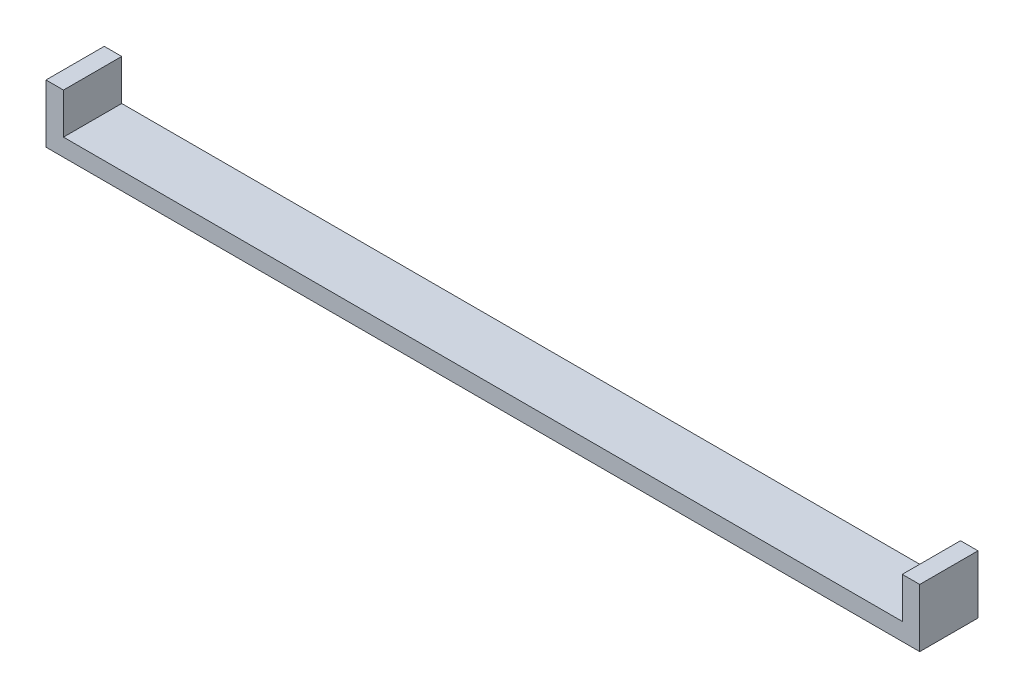
ISO-10303-21;
HEADER;
FILE_DESCRIPTION(('STEP AP214'),'2;1');
FILE_NAME('part.step','',(''),(''),'','','');
FILE_SCHEMA(('AUTOMOTIVE_DESIGN { 1 0 10303 214 1 1 1 1 }'));
ENDSEC;
DATA;
#1=APPLICATION_CONTEXT('core data for automotive mechanical design processes');
#2=APPLICATION_PROTOCOL_DEFINITION('international standard','automotive_design',2000,#1);
#3=PRODUCT_CONTEXT('',#1,'mechanical');
#4=PRODUCT('Part','Part','',(#3));
#5=PRODUCT_RELATED_PRODUCT_CATEGORY('part','',(#4));
#6=PRODUCT_DEFINITION_FORMATION('','',#4);
#7=PRODUCT_DEFINITION_CONTEXT('part definition',#1,'design');
#8=PRODUCT_DEFINITION('design','',#6,#7);
#9=PRODUCT_DEFINITION_SHAPE('','',#8);
#10=(LENGTH_UNIT() NAMED_UNIT(*) SI_UNIT(.MILLI.,.METRE.));
#11=(NAMED_UNIT(*) PLANE_ANGLE_UNIT() SI_UNIT($,.RADIAN.));
#12=(NAMED_UNIT(*) SI_UNIT($,.STERADIAN.) SOLID_ANGLE_UNIT());
#13=UNCERTAINTY_MEASURE_WITH_UNIT(LENGTH_MEASURE(1.E-05),#10,'distance_accuracy_value','');
#14=(GEOMETRIC_REPRESENTATION_CONTEXT(3) GLOBAL_UNCERTAINTY_ASSIGNED_CONTEXT((#13)) GLOBAL_UNIT_ASSIGNED_CONTEXT((#10,
#11,#12)) REPRESENTATION_CONTEXT('',''));
#15=CARTESIAN_POINT('',(0.,0.,0.));
#16=DIRECTION('',(0.,0.,1.));
#17=DIRECTION('',(1.,0.,0.));
#18=AXIS2_PLACEMENT_3D('',#15,#16,#17);
#19=CARTESIAN_POINT('',(-74.3534482758621,-27.9310344827577,10.));
#20=DIRECTION('',(1.,0.,0.));
#21=DIRECTION('',(0.,0.,-1.));
#22=AXIS2_PLACEMENT_3D('',#19,#20,#21);
#23=PLANE('',#22);
#24=DIRECTION('',(0.,-1.,0.));
#25=VECTOR('',#24,1.);
#26=CARTESIAN_POINT('',(-74.3534482758621,-27.9310344827577,0.));
#27=LINE('',#26,#25);
#28=CARTESIAN_POINT('',(-74.3534482758621,-27.9310344827577,0.));
#29=VERTEX_POINT('',#28);
#30=CARTESIAN_POINT('',(-74.3534482758621,-37.9310344827577,0.));
#31=VERTEX_POINT('',#30);
#32=EDGE_CURVE('E140',#29,#31,#27,.T.);
#33=ORIENTED_EDGE('',*,*,#32,.T.);
#34=DIRECTION('',(0.,0.,-1.));
#35=VECTOR('',#34,1.);
#36=CARTESIAN_POINT('',(-74.3534482758621,-37.9310344827577,10.));
#37=LINE('',#36,#35);
#38=CARTESIAN_POINT('',(-74.3534482758621,-37.9310344827577,10.));
#39=VERTEX_POINT('',#38);
#40=EDGE_CURVE('E11',#39,#31,#37,.T.);
#41=ORIENTED_EDGE('',*,*,#40,.F.);
#42=DIRECTION('',(0.,-1.,0.));
#43=VECTOR('',#42,1.);
#44=CARTESIAN_POINT('',(-74.3534482758621,-27.9310344827577,10.));
#45=LINE('',#44,#43);
#46=CARTESIAN_POINT('',(-74.3534482758621,-27.9310344827577,10.));
#47=VERTEX_POINT('',#46);
#48=EDGE_CURVE('E162',#47,#39,#45,.T.);
#49=ORIENTED_EDGE('',*,*,#48,.F.);
#50=DIRECTION('',(0.,0.,-1.));
#51=VECTOR('',#50,1.);
#52=CARTESIAN_POINT('',(-74.3534482758621,-27.9310344827577,10.));
#53=LINE('',#52,#51);
#54=EDGE_CURVE('E136',#47,#29,#53,.T.);
#55=ORIENTED_EDGE('',*,*,#54,.T.);
#56=EDGE_LOOP('',(#33,#41,#49,#55));
#57=FACE_BOUND('',#56,.T.);
#58=ADVANCED_FACE('F39',(#57),#23,.F.);
#59=CARTESIAN_POINT('',(-74.3534482758621,-37.9310344827577,10.));
#60=DIRECTION('',(0.,1.,0.));
#61=DIRECTION('',(-1.,0.,0.));
#62=AXIS2_PLACEMENT_3D('',#59,#60,#61);
#63=PLANE('',#62);
#64=DIRECTION('',(1.,0.,0.));
#65=VECTOR('',#64,1.);
#66=CARTESIAN_POINT('',(-74.3534482758621,-37.9310344827577,0.));
#67=LINE('',#66,#65);
#68=CARTESIAN_POINT('',(75.6465517241379,-37.9310344827586,0.));
#69=VERTEX_POINT('',#68);
#70=EDGE_CURVE('E144',#31,#69,#67,.T.);
#71=ORIENTED_EDGE('',*,*,#70,.T.);
#72=DIRECTION('',(0.,0.,-1.));
#73=VECTOR('',#72,1.);
#74=CARTESIAN_POINT('',(75.6465517241379,-37.9310344827586,10.));
#75=LINE('',#74,#73);
#76=CARTESIAN_POINT('',(75.6465517241379,-37.9310344827586,10.));
#77=VERTEX_POINT('',#76);
#78=EDGE_CURVE('E48',#77,#69,#75,.T.);
#79=ORIENTED_EDGE('',*,*,#78,.F.);
#80=DIRECTION('',(1.,0.,0.));
#81=VECTOR('',#80,1.);
#82=CARTESIAN_POINT('',(-74.3534482758621,-37.9310344827577,10.));
#83=LINE('',#82,#81);
#84=EDGE_CURVE('E99',#39,#77,#83,.T.);
#85=ORIENTED_EDGE('',*,*,#84,.F.);
#86=ORIENTED_EDGE('',*,*,#40,.T.);
#87=EDGE_LOOP('',(#71,#79,#85,#86));
#88=FACE_BOUND('',#87,.T.);
#89=ADVANCED_FACE('F208',(#88),#63,.F.);
#90=CARTESIAN_POINT('',(75.6465517241379,-37.9310344827586,10.));
#91=DIRECTION('',(-1.,0.,0.));
#92=DIRECTION('',(0.,0.,1.));
#93=AXIS2_PLACEMENT_3D('',#90,#91,#92);
#94=PLANE('',#93);
#95=DIRECTION('',(0.,1.,0.));
#96=VECTOR('',#95,1.);
#97=CARTESIAN_POINT('',(75.6465517241379,-37.9310344827586,0.));
#98=LINE('',#97,#96);
#99=CARTESIAN_POINT('',(75.6465517241379,-27.9310344827586,0.));
#100=VERTEX_POINT('',#99);
#101=EDGE_CURVE('E147',#69,#100,#98,.T.);
#102=ORIENTED_EDGE('',*,*,#101,.T.);
#103=DIRECTION('',(0.,0.,-1.));
#104=VECTOR('',#103,1.);
#105=CARTESIAN_POINT('',(75.6465517241379,-27.9310344827586,10.));
#106=LINE('',#105,#104);
#107=CARTESIAN_POINT('',(75.6465517241379,-27.9310344827586,10.));
#108=VERTEX_POINT('',#107);
#109=EDGE_CURVE('E173',#108,#100,#106,.T.);
#110=ORIENTED_EDGE('',*,*,#109,.F.);
#111=DIRECTION('',(0.,1.,0.));
#112=VECTOR('',#111,1.);
#113=CARTESIAN_POINT('',(75.6465517241379,-37.9310344827586,10.));
#114=LINE('',#113,#112);
#115=EDGE_CURVE('E183',#77,#108,#114,.T.);
#116=ORIENTED_EDGE('',*,*,#115,.F.);
#117=ORIENTED_EDGE('',*,*,#78,.T.);
#118=EDGE_LOOP('',(#102,#110,#116,#117));
#119=FACE_BOUND('',#118,.T.);
#120=ADVANCED_FACE('F181',(#119),#94,.F.);
#121=CARTESIAN_POINT('',(75.6465517241379,-27.9310344827586,10.));
#122=DIRECTION('',(0.,-1.,0.));
#123=DIRECTION('',(0.,0.,-1.));
#124=AXIS2_PLACEMENT_3D('',#121,#122,#123);
#125=PLANE('',#124);
#126=DIRECTION('',(-1.,0.,0.));
#127=VECTOR('',#126,1.);
#128=CARTESIAN_POINT('',(75.6465517241379,-27.9310344827586,0.));
#129=LINE('',#128,#127);
#130=CARTESIAN_POINT('',(72.6465517241379,-27.9310344827586,0.));
#131=VERTEX_POINT('',#130);
#132=EDGE_CURVE('E150',#100,#131,#129,.T.);
#133=ORIENTED_EDGE('',*,*,#132,.T.);
#134=DIRECTION('',(0.,0.,-1.));
#135=VECTOR('',#134,1.);
#136=CARTESIAN_POINT('',(72.6465517241379,-27.9310344827586,10.));
#137=LINE('',#136,#135);
#138=CARTESIAN_POINT('',(72.6465517241379,-27.9310344827586,10.));
#139=VERTEX_POINT('',#138);
#140=EDGE_CURVE('E169',#139,#131,#137,.T.);
#141=ORIENTED_EDGE('',*,*,#140,.F.);
#142=DIRECTION('',(-1.,0.,0.));
#143=VECTOR('',#142,1.);
#144=CARTESIAN_POINT('',(75.6465517241379,-27.9310344827586,10.));
#145=LINE('',#144,#143);
#146=EDGE_CURVE('E196',#108,#139,#145,.T.);
#147=ORIENTED_EDGE('',*,*,#146,.F.);
#148=ORIENTED_EDGE('',*,*,#109,.T.);
#149=EDGE_LOOP('',(#133,#141,#147,#148));
#150=FACE_BOUND('',#149,.T.);
#151=ADVANCED_FACE('F191',(#150),#125,.F.);
#152=CARTESIAN_POINT('',(72.6465517241379,-27.9310344827586,10.));
#153=DIRECTION('',(1.,0.,0.));
#154=DIRECTION('',(0.,1.,0.));
#155=AXIS2_PLACEMENT_3D('',#152,#153,#154);
#156=PLANE('',#155);
#157=DIRECTION('',(0.,-1.,0.));
#158=VECTOR('',#157,1.);
#159=CARTESIAN_POINT('',(72.6465517241379,-27.9310344827586,0.));
#160=LINE('',#159,#158);
#161=CARTESIAN_POINT('',(72.6465517241379,-34.9310344827586,0.));
#162=VERTEX_POINT('',#161);
#163=EDGE_CURVE('E153',#131,#162,#160,.T.);
#164=ORIENTED_EDGE('',*,*,#163,.T.);
#165=DIRECTION('',(0.,0.,-1.));
#166=VECTOR('',#165,1.);
#167=CARTESIAN_POINT('',(72.6465517241379,-34.9310344827586,10.));
#168=LINE('',#167,#166);
#169=CARTESIAN_POINT('',(72.6465517241379,-34.9310344827586,10.));
#170=VERTEX_POINT('',#169);
#171=EDGE_CURVE('E129',#170,#162,#168,.T.);
#172=ORIENTED_EDGE('',*,*,#171,.F.);
#173=DIRECTION('',(0.,-1.,0.));
#174=VECTOR('',#173,1.);
#175=CARTESIAN_POINT('',(72.6465517241379,-27.9310344827586,10.));
#176=LINE('',#175,#174);
#177=EDGE_CURVE('E118',#139,#170,#176,.T.);
#178=ORIENTED_EDGE('',*,*,#177,.F.);
#179=ORIENTED_EDGE('',*,*,#140,.T.);
#180=EDGE_LOOP('',(#164,#172,#178,#179));
#181=FACE_BOUND('',#180,.T.);
#182=ADVANCED_FACE('F194',(#181),#156,.F.);
#183=CARTESIAN_POINT('',(72.6465517241379,-34.9310344827586,10.));
#184=DIRECTION('',(0.,-1.,0.));
#185=DIRECTION('',(1.,0.,0.));
#186=AXIS2_PLACEMENT_3D('',#183,#184,#185);
#187=PLANE('',#186);
#188=DIRECTION('',(-1.,0.,0.));
#189=VECTOR('',#188,1.);
#190=CARTESIAN_POINT('',(72.6465517241379,-34.9310344827586,0.));
#191=LINE('',#190,#189);
#192=CARTESIAN_POINT('',(-71.3534482758621,-34.9310344827577,0.));
#193=VERTEX_POINT('',#192);
#194=EDGE_CURVE('E127',#162,#193,#191,.T.);
#195=ORIENTED_EDGE('',*,*,#194,.T.);
#196=DIRECTION('',(0.,0.,-1.));
#197=VECTOR('',#196,1.);
#198=CARTESIAN_POINT('',(-71.3534482758621,-34.9310344827577,10.));
#199=LINE('',#198,#197);
#200=CARTESIAN_POINT('',(-71.3534482758621,-34.9310344827577,10.));
#201=VERTEX_POINT('',#200);
#202=EDGE_CURVE('E124',#201,#193,#199,.T.);
#203=ORIENTED_EDGE('',*,*,#202,.F.);
#204=DIRECTION('',(-1.,0.,0.));
#205=VECTOR('',#204,1.);
#206=CARTESIAN_POINT('',(72.6465517241379,-34.9310344827586,10.));
#207=LINE('',#206,#205);
#208=EDGE_CURVE('E112',#170,#201,#207,.T.);
#209=ORIENTED_EDGE('',*,*,#208,.F.);
#210=ORIENTED_EDGE('',*,*,#171,.T.);
#211=EDGE_LOOP('',(#195,#203,#209,#210));
#212=FACE_BOUND('',#211,.T.);
#213=ADVANCED_FACE('F125',(#212),#187,.F.);
#214=CARTESIAN_POINT('',(-71.3534482758621,-34.9310344827577,10.));
#215=DIRECTION('',(-1.,0.,0.));
#216=DIRECTION('',(0.,0.,1.));
#217=AXIS2_PLACEMENT_3D('',#214,#215,#216);
#218=PLANE('',#217);
#219=DIRECTION('',(0.,1.,0.));
#220=VECTOR('',#219,1.);
#221=CARTESIAN_POINT('',(-71.3534482758621,-34.9310344827577,0.));
#222=LINE('',#221,#220);
#223=CARTESIAN_POINT('',(-71.3534482758621,-27.9310344827577,0.));
#224=VERTEX_POINT('',#223);
#225=EDGE_CURVE('E85',#193,#224,#222,.T.);
#226=ORIENTED_EDGE('',*,*,#225,.T.);
#227=DIRECTION('',(0.,0.,-1.));
#228=VECTOR('',#227,1.);
#229=CARTESIAN_POINT('',(-71.3534482758621,-27.9310344827577,10.));
#230=LINE('',#229,#228);
#231=CARTESIAN_POINT('',(-71.3534482758621,-27.9310344827577,10.));
#232=VERTEX_POINT('',#231);
#233=EDGE_CURVE('E130',#232,#224,#230,.T.);
#234=ORIENTED_EDGE('',*,*,#233,.F.);
#235=DIRECTION('',(0.,1.,0.));
#236=VECTOR('',#235,1.);
#237=CARTESIAN_POINT('',(-71.3534482758621,-34.9310344827577,10.));
#238=LINE('',#237,#236);
#239=EDGE_CURVE('E116',#201,#232,#238,.T.);
#240=ORIENTED_EDGE('',*,*,#239,.F.);
#241=ORIENTED_EDGE('',*,*,#202,.T.);
#242=EDGE_LOOP('',(#226,#234,#240,#241));
#243=FACE_BOUND('',#242,.T.);
#244=ADVANCED_FACE('F132',(#243),#218,.F.);
#245=CARTESIAN_POINT('',(-71.3534482758621,-27.9310344827577,10.));
#246=DIRECTION('',(0.,-1.,0.));
#247=DIRECTION('',(1.,0.,0.));
#248=AXIS2_PLACEMENT_3D('',#245,#246,#247);
#249=PLANE('',#248);
#250=DIRECTION('',(-1.,0.,0.));
#251=VECTOR('',#250,1.);
#252=CARTESIAN_POINT('',(-71.3534482758621,-27.9310344827577,0.));
#253=LINE('',#252,#251);
#254=EDGE_CURVE('E91',#224,#29,#253,.T.);
#255=ORIENTED_EDGE('',*,*,#254,.T.);
#256=ORIENTED_EDGE('',*,*,#54,.F.);
#257=DIRECTION('',(-1.,0.,0.));
#258=VECTOR('',#257,1.);
#259=CARTESIAN_POINT('',(-71.3534482758621,-27.9310344827577,10.));
#260=LINE('',#259,#258);
#261=EDGE_CURVE('E56',#232,#47,#260,.T.);
#262=ORIENTED_EDGE('',*,*,#261,.F.);
#263=ORIENTED_EDGE('',*,*,#233,.T.);
#264=EDGE_LOOP('',(#255,#256,#262,#263));
#265=FACE_BOUND('',#264,.T.);
#266=ADVANCED_FACE('F224',(#265),#249,.F.);
#267=CARTESIAN_POINT('',(0.,0.,10.));
#268=DIRECTION('',(0.,0.,1.));
#269=DIRECTION('',(1.,0.,0.));
#270=AXIS2_PLACEMENT_3D('',#267,#268,#269);
#271=PLANE('',#270);
#272=ORIENTED_EDGE('',*,*,#48,.T.);
#273=ORIENTED_EDGE('',*,*,#84,.T.);
#274=ORIENTED_EDGE('',*,*,#115,.T.);
#275=ORIENTED_EDGE('',*,*,#146,.T.);
#276=ORIENTED_EDGE('',*,*,#177,.T.);
#277=ORIENTED_EDGE('',*,*,#208,.T.);
#278=ORIENTED_EDGE('',*,*,#239,.T.);
#279=ORIENTED_EDGE('',*,*,#261,.T.);
#280=EDGE_LOOP('',(#272,#273,#274,#275,#276,#277,#278,#279));
#281=FACE_BOUND('',#280,.T.);
#282=ADVANCED_FACE('F114',(#281),#271,.T.);
#283=CARTESIAN_POINT('',(0.,0.,0.));
#284=DIRECTION('',(0.,0.,1.));
#285=DIRECTION('',(1.,0.,0.));
#286=AXIS2_PLACEMENT_3D('',#283,#284,#285);
#287=PLANE('',#286);
#288=ORIENTED_EDGE('',*,*,#32,.F.);
#289=ORIENTED_EDGE('',*,*,#254,.F.);
#290=ORIENTED_EDGE('',*,*,#225,.F.);
#291=ORIENTED_EDGE('',*,*,#194,.F.);
#292=ORIENTED_EDGE('',*,*,#163,.F.);
#293=ORIENTED_EDGE('',*,*,#132,.F.);
#294=ORIENTED_EDGE('',*,*,#101,.F.);
#295=ORIENTED_EDGE('',*,*,#70,.F.);
#296=EDGE_LOOP('',(#288,#289,#290,#291,#292,#293,#294,#295));
#297=FACE_BOUND('',#296,.T.);
#298=ADVANCED_FACE('F187',(#297),#287,.F.);
#299=CLOSED_SHELL('',(#58,#89,#120,#151,#182,#213,#244,#266,#282,#298));
#300=MANIFOLD_SOLID_BREP('B2',#299);
#301=ADVANCED_BREP_SHAPE_REPRESENTATION('',(#18,#300),#14);
#302=SHAPE_DEFINITION_REPRESENTATION(#9,#301);
ENDSEC;
END-ISO-10303-21;
